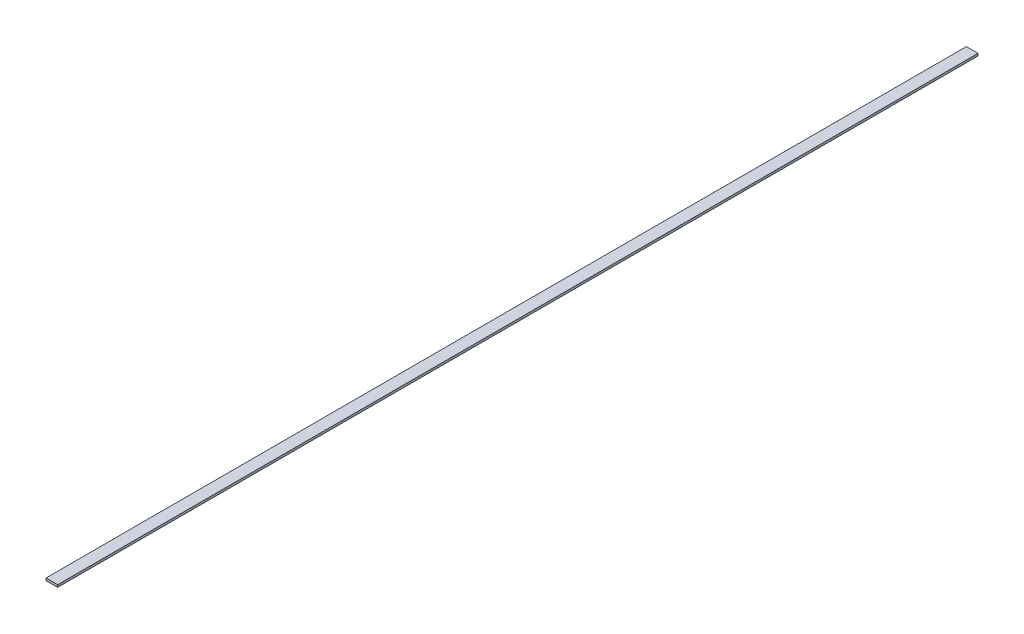
ISO-10303-21;
HEADER;
FILE_DESCRIPTION(('STEP AP214'),'2;1');
FILE_NAME('part.step','',(''),(''),'','','');
FILE_SCHEMA(('AUTOMOTIVE_DESIGN { 1 0 10303 214 1 1 1 1 }'));
ENDSEC;
DATA;
#1=APPLICATION_CONTEXT('core data for automotive mechanical design processes');
#2=APPLICATION_PROTOCOL_DEFINITION('international standard','automotive_design',2000,#1);
#3=PRODUCT_CONTEXT('',#1,'mechanical');
#4=PRODUCT('Part','Part','',(#3));
#5=PRODUCT_RELATED_PRODUCT_CATEGORY('part','',(#4));
#6=PRODUCT_DEFINITION_FORMATION('','',#4);
#7=PRODUCT_DEFINITION_CONTEXT('part definition',#1,'design');
#8=PRODUCT_DEFINITION('design','',#6,#7);
#9=PRODUCT_DEFINITION_SHAPE('','',#8);
#10=(LENGTH_UNIT() NAMED_UNIT(*) SI_UNIT(.MILLI.,.METRE.));
#11=(NAMED_UNIT(*) PLANE_ANGLE_UNIT() SI_UNIT($,.RADIAN.));
#12=(NAMED_UNIT(*) SI_UNIT($,.STERADIAN.) SOLID_ANGLE_UNIT());
#13=UNCERTAINTY_MEASURE_WITH_UNIT(LENGTH_MEASURE(1.E-05),#10,'distance_accuracy_value','');
#14=(GEOMETRIC_REPRESENTATION_CONTEXT(3) GLOBAL_UNCERTAINTY_ASSIGNED_CONTEXT((#13)) GLOBAL_UNIT_ASSIGNED_CONTEXT((#10,
#11,#12)) REPRESENTATION_CONTEXT('',''));
#15=CARTESIAN_POINT('',(0.,0.,0.));
#16=DIRECTION('',(0.,0.,1.));
#17=DIRECTION('',(1.,0.,0.));
#18=AXIS2_PLACEMENT_3D('',#15,#16,#17);
#19=CARTESIAN_POINT('',(-6.98499999999998,2.43416666666667,2006.6));
#20=DIRECTION('',(1.,0.,0.));
#21=DIRECTION('',(0.,0.,-1.));
#22=AXIS2_PLACEMENT_3D('',#19,#20,#21);
#23=PLANE('',#22);
#24=DIRECTION('',(0.,-1.,0.));
#25=VECTOR('',#24,1.);
#26=CARTESIAN_POINT('',(-6.98499999999998,2.43416666666667,0.));
#27=LINE('',#26,#25);
#28=CARTESIAN_POINT('',(-6.98499999999998,2.43416666666667,0.));
#29=VERTEX_POINT('',#28);
#30=CARTESIAN_POINT('',(-6.98499999999998,-2.64583333333333,0.));
#31=VERTEX_POINT('',#30);
#32=EDGE_CURVE('E107',#29,#31,#27,.T.);
#33=ORIENTED_EDGE('',*,*,#32,.T.);
#34=DIRECTION('',(0.,0.,-1.));
#35=VECTOR('',#34,1.);
#36=CARTESIAN_POINT('',(-6.98499999999998,-2.64583333333333,2006.6));
#37=LINE('',#36,#35);
#38=CARTESIAN_POINT('',(-6.98499999999998,-2.64583333333333,2006.6));
#39=VERTEX_POINT('',#38);
#40=EDGE_CURVE('E11',#39,#31,#37,.T.);
#41=ORIENTED_EDGE('',*,*,#40,.F.);
#42=DIRECTION('',(0.,-1.,0.));
#43=VECTOR('',#42,1.);
#44=CARTESIAN_POINT('',(-6.98499999999998,2.43416666666667,2006.6));
#45=LINE('',#44,#43);
#46=CARTESIAN_POINT('',(-6.98499999999998,2.43416666666667,2006.6));
#47=VERTEX_POINT('',#46);
#48=EDGE_CURVE('E91',#47,#39,#45,.T.);
#49=ORIENTED_EDGE('',*,*,#48,.F.);
#50=DIRECTION('',(0.,0.,-1.));
#51=VECTOR('',#50,1.);
#52=CARTESIAN_POINT('',(-6.98499999999998,2.43416666666667,2006.6));
#53=LINE('',#52,#51);
#54=EDGE_CURVE('E103',#47,#29,#53,.T.);
#55=ORIENTED_EDGE('',*,*,#54,.T.);
#56=EDGE_LOOP('',(#33,#41,#49,#55));
#57=FACE_BOUND('',#56,.T.);
#58=ADVANCED_FACE('F39',(#57),#23,.F.);
#59=CARTESIAN_POINT('',(-6.98499999999998,-2.64583333333333,2006.6));
#60=DIRECTION('',(0.,1.,0.));
#61=DIRECTION('',(0.,0.,1.));
#62=AXIS2_PLACEMENT_3D('',#59,#60,#61);
#63=PLANE('',#62);
#64=DIRECTION('',(1.,0.,0.));
#65=VECTOR('',#64,1.);
#66=CARTESIAN_POINT('',(-6.98499999999998,-2.64583333333333,0.));
#67=LINE('',#66,#65);
#68=CARTESIAN_POINT('',(18.415,-2.64583333333333,0.));
#69=VERTEX_POINT('',#68);
#70=EDGE_CURVE('E96',#31,#69,#67,.T.);
#71=ORIENTED_EDGE('',*,*,#70,.T.);
#72=DIRECTION('',(0.,0.,-1.));
#73=VECTOR('',#72,1.);
#74=CARTESIAN_POINT('',(18.415,-2.64583333333333,2006.6));
#75=LINE('',#74,#73);
#76=CARTESIAN_POINT('',(18.415,-2.64583333333333,2006.6));
#77=VERTEX_POINT('',#76);
#78=EDGE_CURVE('E48',#77,#69,#75,.T.);
#79=ORIENTED_EDGE('',*,*,#78,.F.);
#80=DIRECTION('',(1.,0.,0.));
#81=VECTOR('',#80,1.);
#82=CARTESIAN_POINT('',(-6.98499999999998,-2.64583333333333,2006.6));
#83=LINE('',#82,#81);
#84=EDGE_CURVE('E86',#39,#77,#83,.T.);
#85=ORIENTED_EDGE('',*,*,#84,.F.);
#86=ORIENTED_EDGE('',*,*,#40,.T.);
#87=EDGE_LOOP('',(#71,#79,#85,#86));
#88=FACE_BOUND('',#87,.T.);
#89=ADVANCED_FACE('F95',(#88),#63,.F.);
#90=CARTESIAN_POINT('',(18.415,2.43416666666667,2006.6));
#91=DIRECTION('',(-1.,0.,0.));
#92=DIRECTION('',(0.,0.,1.));
#93=AXIS2_PLACEMENT_3D('',#90,#91,#92);
#94=PLANE('',#93);
#95=DIRECTION('',(0.,1.,0.));
#96=VECTOR('',#95,1.);
#97=CARTESIAN_POINT('',(18.415,2.43416666666667,0.));
#98=LINE('',#97,#96);
#99=CARTESIAN_POINT('',(18.415,2.43416666666667,0.));
#100=VERTEX_POINT('',#99);
#101=EDGE_CURVE('E73',#69,#100,#98,.T.);
#102=ORIENTED_EDGE('',*,*,#101,.T.);
#103=DIRECTION('',(0.,0.,-1.));
#104=VECTOR('',#103,1.);
#105=CARTESIAN_POINT('',(18.415,2.43416666666667,2006.6));
#106=LINE('',#105,#104);
#107=CARTESIAN_POINT('',(18.415,2.43416666666667,2006.6));
#108=VERTEX_POINT('',#107);
#109=EDGE_CURVE('E98',#108,#100,#106,.T.);
#110=ORIENTED_EDGE('',*,*,#109,.F.);
#111=DIRECTION('',(0.,1.,0.));
#112=VECTOR('',#111,1.);
#113=CARTESIAN_POINT('',(18.415,2.43416666666667,2006.6));
#114=LINE('',#113,#112);
#115=EDGE_CURVE('E89',#77,#108,#114,.T.);
#116=ORIENTED_EDGE('',*,*,#115,.F.);
#117=ORIENTED_EDGE('',*,*,#78,.T.);
#118=EDGE_LOOP('',(#102,#110,#116,#117));
#119=FACE_BOUND('',#118,.T.);
#120=ADVANCED_FACE('F99',(#119),#94,.F.);
#121=CARTESIAN_POINT('',(-6.98499999999998,2.43416666666667,2006.6));
#122=DIRECTION('',(0.,-1.,0.));
#123=DIRECTION('',(0.,0.,-1.));
#124=AXIS2_PLACEMENT_3D('',#121,#122,#123);
#125=PLANE('',#124);
#126=DIRECTION('',(-1.,0.,0.));
#127=VECTOR('',#126,1.);
#128=CARTESIAN_POINT('',(-6.98499999999998,2.43416666666667,0.));
#129=LINE('',#128,#127);
#130=EDGE_CURVE('E79',#100,#29,#129,.T.);
#131=ORIENTED_EDGE('',*,*,#130,.T.);
#132=ORIENTED_EDGE('',*,*,#54,.F.);
#133=DIRECTION('',(-1.,0.,0.));
#134=VECTOR('',#133,1.);
#135=CARTESIAN_POINT('',(-6.98499999999998,2.43416666666667,2006.6));
#136=LINE('',#135,#134);
#137=EDGE_CURVE('E56',#108,#47,#136,.T.);
#138=ORIENTED_EDGE('',*,*,#137,.F.);
#139=ORIENTED_EDGE('',*,*,#109,.T.);
#140=EDGE_LOOP('',(#131,#132,#138,#139));
#141=FACE_BOUND('',#140,.T.);
#142=ADVANCED_FACE('F120',(#141),#125,.F.);
#143=CARTESIAN_POINT('',(0.,0.,2006.6));
#144=DIRECTION('',(0.,0.,1.));
#145=DIRECTION('',(1.,0.,0.));
#146=AXIS2_PLACEMENT_3D('',#143,#144,#145);
#147=PLANE('',#146);
#148=ORIENTED_EDGE('',*,*,#48,.T.);
#149=ORIENTED_EDGE('',*,*,#84,.T.);
#150=ORIENTED_EDGE('',*,*,#115,.T.);
#151=ORIENTED_EDGE('',*,*,#137,.T.);
#152=EDGE_LOOP('',(#148,#149,#150,#151));
#153=FACE_BOUND('',#152,.T.);
#154=ADVANCED_FACE('F87',(#153),#147,.T.);
#155=CARTESIAN_POINT('',(0.,0.,0.));
#156=DIRECTION('',(0.,0.,1.));
#157=DIRECTION('',(1.,0.,0.));
#158=AXIS2_PLACEMENT_3D('',#155,#156,#157);
#159=PLANE('',#158);
#160=ORIENTED_EDGE('',*,*,#32,.F.);
#161=ORIENTED_EDGE('',*,*,#130,.F.);
#162=ORIENTED_EDGE('',*,*,#101,.F.);
#163=ORIENTED_EDGE('',*,*,#70,.F.);
#164=EDGE_LOOP('',(#160,#161,#162,#163));
#165=FACE_BOUND('',#164,.T.);
#166=ADVANCED_FACE('F123',(#165),#159,.F.);
#167=CLOSED_SHELL('',(#58,#89,#120,#142,#154,#166));
#168=MANIFOLD_SOLID_BREP('B2',#167);
#169=ADVANCED_BREP_SHAPE_REPRESENTATION('',(#18,#168),#14);
#170=SHAPE_DEFINITION_REPRESENTATION(#9,#169);
ENDSEC;
END-ISO-10303-21;
